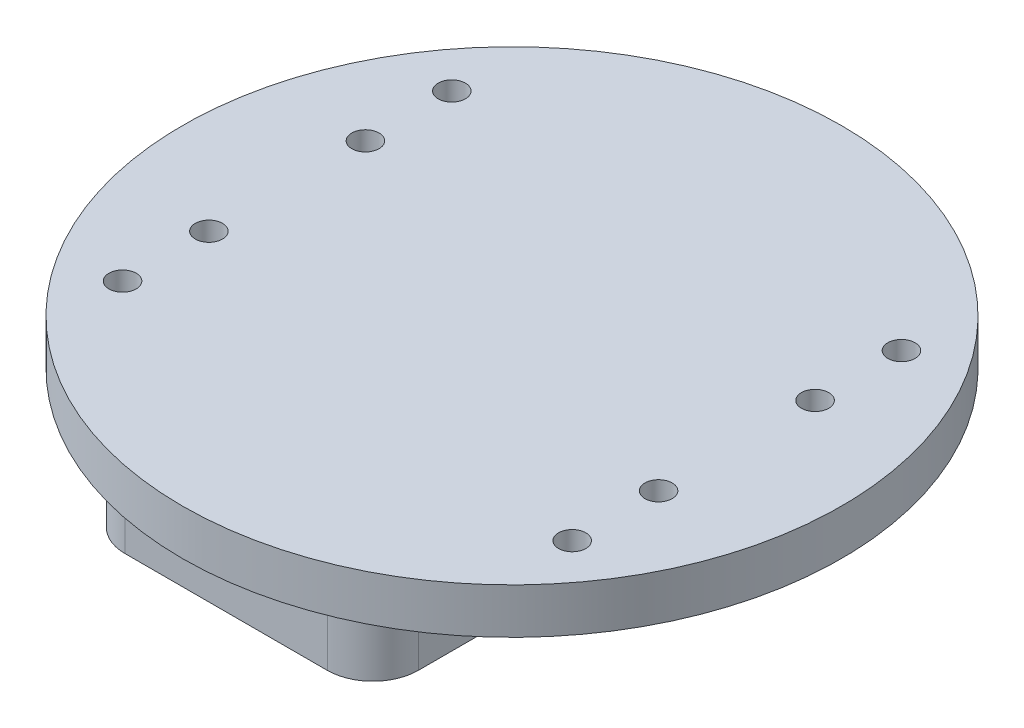
ISO-10303-21;
HEADER;
FILE_DESCRIPTION(('STEP AP214'),'2;1');
FILE_NAME('part.step','',(''),(''),'','','');
FILE_SCHEMA(('AUTOMOTIVE_DESIGN { 1 0 10303 214 1 1 1 1 }'));
ENDSEC;
DATA;
#1=APPLICATION_CONTEXT('core data for automotive mechanical design processes');
#2=APPLICATION_PROTOCOL_DEFINITION('international standard','automotive_design',2000,#1);
#3=PRODUCT_CONTEXT('',#1,'mechanical');
#4=PRODUCT('Part','Part','',(#3));
#5=PRODUCT_RELATED_PRODUCT_CATEGORY('part','',(#4));
#6=PRODUCT_DEFINITION_FORMATION('','',#4);
#7=PRODUCT_DEFINITION_CONTEXT('part definition',#1,'design');
#8=PRODUCT_DEFINITION('design','',#6,#7);
#9=PRODUCT_DEFINITION_SHAPE('','',#8);
#10=(LENGTH_UNIT() NAMED_UNIT(*) SI_UNIT(.MILLI.,.METRE.));
#11=(NAMED_UNIT(*) PLANE_ANGLE_UNIT() SI_UNIT($,.RADIAN.));
#12=(NAMED_UNIT(*) SI_UNIT($,.STERADIAN.) SOLID_ANGLE_UNIT());
#13=UNCERTAINTY_MEASURE_WITH_UNIT(LENGTH_MEASURE(1.E-05),#10,'distance_accuracy_value','');
#14=(GEOMETRIC_REPRESENTATION_CONTEXT(3) GLOBAL_UNCERTAINTY_ASSIGNED_CONTEXT((#13)) GLOBAL_UNIT_ASSIGNED_CONTEXT((#10,
#11,#12)) REPRESENTATION_CONTEXT('',''));
#15=CARTESIAN_POINT('',(0.,0.,0.));
#16=DIRECTION('',(0.,0.,1.));
#17=DIRECTION('',(1.,0.,0.));
#18=AXIS2_PLACEMENT_3D('',#15,#16,#17);
#19=CARTESIAN_POINT('',(0.,0.,0.));
#20=DIRECTION('',(0.,1.,0.));
#21=DIRECTION('',(0.,0.,1.));
#22=AXIS2_PLACEMENT_3D('',#19,#20,#21);
#23=PLANE('',#22);
#24=CARTESIAN_POINT('',(49.4583477426702,0.,17.2159503754645));
#25=DIRECTION('',(0.,1.,0.));
#26=DIRECTION('',(0.,0.,-1.));
#27=AXIS2_PLACEMENT_3D('',#24,#25,#26);
#28=CIRCLE('',#27,3.);
#29=CARTESIAN_POINT('',(49.4583477426702,0.,14.2159503754645));
#30=VERTEX_POINT('',#29);
#31=EDGE_CURVE('E336',#30,#30,#28,.T.);
#32=ORIENTED_EDGE('',*,*,#31,.T.);
#33=EDGE_LOOP('',(#32));
#34=FACE_BOUND('',#33,.T.);
#35=CARTESIAN_POINT('',(49.4583477426704,0.,36.2159503754645));
#36=DIRECTION('',(0.,1.,0.));
#37=DIRECTION('',(0.,0.,-1.));
#38=AXIS2_PLACEMENT_3D('',#35,#36,#37);
#39=CIRCLE('',#38,3.);
#40=CARTESIAN_POINT('',(49.4583477426704,0.,33.2159503754645));
#41=VERTEX_POINT('',#40);
#42=EDGE_CURVE('E332',#41,#41,#39,.T.);
#43=ORIENTED_EDGE('',*,*,#42,.T.);
#44=EDGE_LOOP('',(#43));
#45=FACE_BOUND('',#44,.T.);
#46=CARTESIAN_POINT('',(49.4583477426702,0.,-17.2159503754645));
#47=DIRECTION('',(0.,-1.,0.));
#48=DIRECTION('',(0.,0.,1.));
#49=AXIS2_PLACEMENT_3D('',#46,#47,#48);
#50=CIRCLE('',#49,3.);
#51=CARTESIAN_POINT('',(49.4583477426702,0.,-14.2159503754645));
#52=VERTEX_POINT('',#51);
#53=EDGE_CURVE('E328',#52,#52,#50,.T.);
#54=ORIENTED_EDGE('',*,*,#53,.F.);
#55=EDGE_LOOP('',(#54));
#56=FACE_BOUND('',#55,.T.);
#57=CARTESIAN_POINT('',(49.4583477426704,0.,-36.2159503754645));
#58=DIRECTION('',(0.,-1.,0.));
#59=DIRECTION('',(0.,0.,1.));
#60=AXIS2_PLACEMENT_3D('',#57,#58,#59);
#61=CIRCLE('',#60,3.);
#62=CARTESIAN_POINT('',(49.4583477426704,0.,-33.2159503754645));
#63=VERTEX_POINT('',#62);
#64=EDGE_CURVE('E324',#63,#63,#61,.T.);
#65=ORIENTED_EDGE('',*,*,#64,.F.);
#66=EDGE_LOOP('',(#65));
#67=FACE_BOUND('',#66,.T.);
#68=CARTESIAN_POINT('',(-49.4583477426702,0.,-17.2159503754645));
#69=DIRECTION('',(0.,1.,0.));
#70=DIRECTION('',(0.,0.,1.));
#71=AXIS2_PLACEMENT_3D('',#68,#69,#70);
#72=CIRCLE('',#71,3.);
#73=CARTESIAN_POINT('',(-49.4583477426702,0.,-14.2159503754645));
#74=VERTEX_POINT('',#73);
#75=EDGE_CURVE('E320',#74,#74,#72,.T.);
#76=ORIENTED_EDGE('',*,*,#75,.T.);
#77=EDGE_LOOP('',(#76));
#78=FACE_BOUND('',#77,.T.);
#79=CARTESIAN_POINT('',(-49.4583477426704,0.,-36.2159503754645));
#80=DIRECTION('',(0.,1.,0.));
#81=DIRECTION('',(0.,0.,1.));
#82=AXIS2_PLACEMENT_3D('',#79,#80,#81);
#83=CIRCLE('',#82,3.);
#84=CARTESIAN_POINT('',(-49.4583477426704,0.,-33.2159503754645));
#85=VERTEX_POINT('',#84);
#86=EDGE_CURVE('E316',#85,#85,#83,.T.);
#87=ORIENTED_EDGE('',*,*,#86,.T.);
#88=EDGE_LOOP('',(#87));
#89=FACE_BOUND('',#88,.T.);
#90=CARTESIAN_POINT('',(-49.4583477426702,0.,17.2159503754645));
#91=DIRECTION('',(0.,-1.,0.));
#92=DIRECTION('',(0.,0.,-1.));
#93=AXIS2_PLACEMENT_3D('',#90,#91,#92);
#94=CIRCLE('',#93,3.);
#95=CARTESIAN_POINT('',(-49.4583477426702,0.,14.2159503754645));
#96=VERTEX_POINT('',#95);
#97=EDGE_CURVE('E312',#96,#96,#94,.T.);
#98=ORIENTED_EDGE('',*,*,#97,.F.);
#99=EDGE_LOOP('',(#98));
#100=FACE_BOUND('',#99,.T.);
#101=CARTESIAN_POINT('',(-49.4583477426704,0.,36.2159503754645));
#102=DIRECTION('',(0.,-1.,0.));
#103=DIRECTION('',(0.,0.,-1.));
#104=AXIS2_PLACEMENT_3D('',#101,#102,#103);
#105=CIRCLE('',#104,3.);
#106=CARTESIAN_POINT('',(-49.4583477426704,0.,33.2159503754645));
#107=VERTEX_POINT('',#106);
#108=EDGE_CURVE('E308',#107,#107,#105,.T.);
#109=ORIENTED_EDGE('',*,*,#108,.F.);
#110=EDGE_LOOP('',(#109));
#111=FACE_BOUND('',#110,.T.);
#112=DIRECTION('',(1.,0.,0.));
#113=VECTOR('',#112,1.);
#114=CARTESIAN_POINT('',(-32.2469004511277,0.,-15.536222893696));
#115=LINE('',#114,#113);
#116=CARTESIAN_POINT('',(-32.2469004511277,0.,-15.536222893696));
#117=VERTEX_POINT('',#116);
#118=CARTESIAN_POINT('',(32.2469004511276,0.,-15.536222893696));
#119=VERTEX_POINT('',#118);
#120=EDGE_CURVE('E162',#117,#119,#115,.T.);
#121=ORIENTED_EDGE('',*,*,#120,.T.);
#122=DIRECTION('',(0.,0.,-1.));
#123=VECTOR('',#122,1.);
#124=CARTESIAN_POINT('',(32.2469004511277,0.,-52.8651138281339));
#125=LINE('',#124,#123);
#126=CARTESIAN_POINT('',(32.2469004511277,0.,-52.8651138281339));
#127=VERTEX_POINT('',#126);
#128=EDGE_CURVE('E128',#119,#127,#125,.T.);
#129=ORIENTED_EDGE('',*,*,#128,.T.);
#130=CARTESIAN_POINT('',(22.2469004511277,0.,-52.8651138281339));
#131=DIRECTION('',(0.,1.,0.));
#132=DIRECTION('',(0.,0.,1.));
#133=AXIS2_PLACEMENT_3D('',#130,#131,#132);
#134=CIRCLE('',#133,10.);
#135=CARTESIAN_POINT('',(22.2469004511277,0.,-62.8651138281339));
#136=VERTEX_POINT('',#135);
#137=EDGE_CURVE('E145',#127,#136,#134,.T.);
#138=ORIENTED_EDGE('',*,*,#137,.T.);
#139=DIRECTION('',(-1.,0.,0.));
#140=VECTOR('',#139,1.);
#141=CARTESIAN_POINT('',(-22.2469004511277,0.,-62.8651138281339));
#142=LINE('',#141,#140);
#143=CARTESIAN_POINT('',(-22.2469004511277,0.,-62.8651138281339));
#144=VERTEX_POINT('',#143);
#145=EDGE_CURVE('E48',#136,#144,#142,.T.);
#146=ORIENTED_EDGE('',*,*,#145,.T.);
#147=CARTESIAN_POINT('',(-22.2469004511277,0.,-52.8651138281339));
#148=DIRECTION('',(0.,1.,0.));
#149=DIRECTION('',(0.,0.,1.));
#150=AXIS2_PLACEMENT_3D('',#147,#148,#149);
#151=CIRCLE('',#150,10.);
#152=CARTESIAN_POINT('',(-32.2469004511277,0.,-52.8651138281339));
#153=VERTEX_POINT('',#152);
#154=EDGE_CURVE('E168',#144,#153,#151,.T.);
#155=ORIENTED_EDGE('',*,*,#154,.T.);
#156=DIRECTION('',(0.,0.,1.));
#157=VECTOR('',#156,1.);
#158=CARTESIAN_POINT('',(-32.2469004511277,0.,-52.8651138281339));
#159=LINE('',#158,#157);
#160=EDGE_CURVE('E165',#153,#117,#159,.T.);
#161=ORIENTED_EDGE('',*,*,#160,.T.);
#162=EDGE_LOOP('',(#121,#129,#138,#146,#155,#161));
#163=FACE_BOUND('',#162,.T.);
#164=CARTESIAN_POINT('',(0.,0.,0.));
#165=DIRECTION('',(0.,1.,0.));
#166=DIRECTION('',(0.,0.,1.));
#167=AXIS2_PLACEMENT_3D('',#164,#165,#166);
#168=CIRCLE('',#167,72.5);
#169=CARTESIAN_POINT('',(0.,0.,72.5));
#170=VERTEX_POINT('',#169);
#171=EDGE_CURVE('E37',#170,#170,#168,.T.);
#172=ORIENTED_EDGE('',*,*,#171,.F.);
#173=EDGE_LOOP('',(#172));
#174=FACE_BOUND('',#173,.T.);
#175=DIRECTION('',(0.,0.,1.));
#176=VECTOR('',#175,1.);
#177=CARTESIAN_POINT('',(32.2469004511277,0.,52.8651138281339));
#178=LINE('',#177,#176);
#179=CARTESIAN_POINT('',(32.2469004511276,0.,15.536222893696));
#180=VERTEX_POINT('',#179);
#181=CARTESIAN_POINT('',(32.2469004511277,0.,52.8651138281339));
#182=VERTEX_POINT('',#181);
#183=EDGE_CURVE('E133',#180,#182,#178,.T.);
#184=ORIENTED_EDGE('',*,*,#183,.F.);
#185=DIRECTION('',(1.,0.,0.));
#186=VECTOR('',#185,1.);
#187=CARTESIAN_POINT('',(-32.2469004511277,0.,15.536222893696));
#188=LINE('',#187,#186);
#189=CARTESIAN_POINT('',(-32.2469004511277,0.,15.536222893696));
#190=VERTEX_POINT('',#189);
#191=EDGE_CURVE('E186',#190,#180,#188,.T.);
#192=ORIENTED_EDGE('',*,*,#191,.F.);
#193=DIRECTION('',(0.,0.,-1.));
#194=VECTOR('',#193,1.);
#195=CARTESIAN_POINT('',(-32.2469004511277,0.,52.8651138281339));
#196=LINE('',#195,#194);
#197=CARTESIAN_POINT('',(-32.2469004511277,0.,52.8651138281339));
#198=VERTEX_POINT('',#197);
#199=EDGE_CURVE('E206',#198,#190,#196,.T.);
#200=ORIENTED_EDGE('',*,*,#199,.F.);
#201=CARTESIAN_POINT('',(-22.2469004511277,0.,52.8651138281339));
#202=DIRECTION('',(0.,-1.,0.));
#203=DIRECTION('',(0.,0.,-1.));
#204=AXIS2_PLACEMENT_3D('',#201,#202,#203);
#205=CIRCLE('',#204,10.);
#206=CARTESIAN_POINT('',(-22.2469004511277,0.,62.8651138281339));
#207=VERTEX_POINT('',#206);
#208=EDGE_CURVE('E203',#207,#198,#205,.T.);
#209=ORIENTED_EDGE('',*,*,#208,.F.);
#210=DIRECTION('',(-1.,0.,0.));
#211=VECTOR('',#210,1.);
#212=CARTESIAN_POINT('',(-22.2469004511277,0.,62.8651138281339));
#213=LINE('',#212,#211);
#214=CARTESIAN_POINT('',(22.2469004511277,0.,62.8651138281339));
#215=VERTEX_POINT('',#214);
#216=EDGE_CURVE('E200',#215,#207,#213,.T.);
#217=ORIENTED_EDGE('',*,*,#216,.F.);
#218=CARTESIAN_POINT('',(22.2469004511277,0.,52.8651138281339));
#219=DIRECTION('',(0.,-1.,0.));
#220=DIRECTION('',(0.,0.,-1.));
#221=AXIS2_PLACEMENT_3D('',#218,#219,#220);
#222=CIRCLE('',#221,10.);
#223=EDGE_CURVE('E56',#182,#215,#222,.T.);
#224=ORIENTED_EDGE('',*,*,#223,.F.);
#225=EDGE_LOOP('',(#184,#192,#200,#209,#217,#224));
#226=FACE_BOUND('',#225,.T.);
#227=ADVANCED_FACE('F33',(#34,#45,#56,#67,#78,#89,#100,#111,#163,#174,#226),#23,.F.);
#228=CARTESIAN_POINT('',(0.,10.,0.));
#229=DIRECTION('',(0.,-1.,0.));
#230=DIRECTION('',(0.,0.,-1.));
#231=AXIS2_PLACEMENT_3D('',#228,#229,#230);
#232=CYLINDRICAL_SURFACE('',#231,72.5);
#233=CARTESIAN_POINT('',(0.,10.,0.));
#234=DIRECTION('',(0.,1.,0.));
#235=DIRECTION('',(0.,0.,1.));
#236=AXIS2_PLACEMENT_3D('',#233,#234,#235);
#237=CIRCLE('',#236,72.5);
#238=CARTESIAN_POINT('',(0.,10.,72.5));
#239=VERTEX_POINT('',#238);
#240=EDGE_CURVE('E11',#239,#239,#237,.T.);
#241=ORIENTED_EDGE('',*,*,#240,.F.);
#242=EDGE_LOOP('',(#241));
#243=FACE_BOUND('',#242,.T.);
#244=ORIENTED_EDGE('',*,*,#171,.T.);
#245=EDGE_LOOP('',(#244));
#246=FACE_BOUND('',#245,.T.);
#247=ADVANCED_FACE('F35',(#243,#246),#232,.T.);
#248=CARTESIAN_POINT('',(0.,10.,0.));
#249=DIRECTION('',(0.,1.,0.));
#250=DIRECTION('',(0.,0.,1.));
#251=AXIS2_PLACEMENT_3D('',#248,#249,#250);
#252=PLANE('',#251);
#253=CARTESIAN_POINT('',(49.4583477426702,10.,17.2159503754645));
#254=DIRECTION('',(0.,1.,0.));
#255=DIRECTION('',(0.,0.,-1.));
#256=AXIS2_PLACEMENT_3D('',#253,#254,#255);
#257=CIRCLE('',#256,3.);
#258=CARTESIAN_POINT('',(49.4583477426702,10.,14.2159503754645));
#259=VERTEX_POINT('',#258);
#260=EDGE_CURVE('E278',#259,#259,#257,.T.);
#261=ORIENTED_EDGE('',*,*,#260,.F.);
#262=EDGE_LOOP('',(#261));
#263=FACE_BOUND('',#262,.T.);
#264=CARTESIAN_POINT('',(49.4583477426704,10.,36.2159503754645));
#265=DIRECTION('',(0.,1.,0.));
#266=DIRECTION('',(0.,0.,-1.));
#267=AXIS2_PLACEMENT_3D('',#264,#265,#266);
#268=CIRCLE('',#267,3.);
#269=CARTESIAN_POINT('',(49.4583477426704,10.,33.2159503754645));
#270=VERTEX_POINT('',#269);
#271=EDGE_CURVE('E282',#270,#270,#268,.T.);
#272=ORIENTED_EDGE('',*,*,#271,.F.);
#273=EDGE_LOOP('',(#272));
#274=FACE_BOUND('',#273,.T.);
#275=CARTESIAN_POINT('',(49.4583477426702,10.,-17.2159503754645));
#276=DIRECTION('',(0.,-1.,0.));
#277=DIRECTION('',(0.,0.,1.));
#278=AXIS2_PLACEMENT_3D('',#275,#276,#277);
#279=CIRCLE('',#278,3.);
#280=CARTESIAN_POINT('',(49.4583477426702,10.,-14.2159503754645));
#281=VERTEX_POINT('',#280);
#282=EDGE_CURVE('E286',#281,#281,#279,.T.);
#283=ORIENTED_EDGE('',*,*,#282,.T.);
#284=EDGE_LOOP('',(#283));
#285=FACE_BOUND('',#284,.T.);
#286=CARTESIAN_POINT('',(49.4583477426704,10.,-36.2159503754645));
#287=DIRECTION('',(0.,-1.,0.));
#288=DIRECTION('',(0.,0.,1.));
#289=AXIS2_PLACEMENT_3D('',#286,#287,#288);
#290=CIRCLE('',#289,3.);
#291=CARTESIAN_POINT('',(49.4583477426704,10.,-33.2159503754645));
#292=VERTEX_POINT('',#291);
#293=EDGE_CURVE('E290',#292,#292,#290,.T.);
#294=ORIENTED_EDGE('',*,*,#293,.T.);
#295=EDGE_LOOP('',(#294));
#296=FACE_BOUND('',#295,.T.);
#297=CARTESIAN_POINT('',(-49.4583477426702,10.,-17.2159503754645));
#298=DIRECTION('',(0.,1.,0.));
#299=DIRECTION('',(0.,0.,1.));
#300=AXIS2_PLACEMENT_3D('',#297,#298,#299);
#301=CIRCLE('',#300,3.);
#302=CARTESIAN_POINT('',(-49.4583477426702,10.,-14.2159503754645));
#303=VERTEX_POINT('',#302);
#304=EDGE_CURVE('E294',#303,#303,#301,.T.);
#305=ORIENTED_EDGE('',*,*,#304,.F.);
#306=EDGE_LOOP('',(#305));
#307=FACE_BOUND('',#306,.T.);
#308=CARTESIAN_POINT('',(-49.4583477426704,10.,-36.2159503754645));
#309=DIRECTION('',(0.,1.,0.));
#310=DIRECTION('',(0.,0.,1.));
#311=AXIS2_PLACEMENT_3D('',#308,#309,#310);
#312=CIRCLE('',#311,3.);
#313=CARTESIAN_POINT('',(-49.4583477426704,10.,-33.2159503754645));
#314=VERTEX_POINT('',#313);
#315=EDGE_CURVE('E298',#314,#314,#312,.T.);
#316=ORIENTED_EDGE('',*,*,#315,.F.);
#317=EDGE_LOOP('',(#316));
#318=FACE_BOUND('',#317,.T.);
#319=CARTESIAN_POINT('',(-49.4583477426702,10.,17.2159503754645));
#320=DIRECTION('',(0.,-1.,0.));
#321=DIRECTION('',(0.,0.,-1.));
#322=AXIS2_PLACEMENT_3D('',#319,#320,#321);
#323=CIRCLE('',#322,3.);
#324=CARTESIAN_POINT('',(-49.4583477426702,10.,14.2159503754645));
#325=VERTEX_POINT('',#324);
#326=EDGE_CURVE('E302',#325,#325,#323,.T.);
#327=ORIENTED_EDGE('',*,*,#326,.T.);
#328=EDGE_LOOP('',(#327));
#329=FACE_BOUND('',#328,.T.);
#330=CARTESIAN_POINT('',(-49.4583477426704,10.,36.2159503754645));
#331=DIRECTION('',(0.,-1.,0.));
#332=DIRECTION('',(0.,0.,-1.));
#333=AXIS2_PLACEMENT_3D('',#330,#331,#332);
#334=CIRCLE('',#333,3.);
#335=CARTESIAN_POINT('',(-49.4583477426704,10.,33.2159503754645));
#336=VERTEX_POINT('',#335);
#337=EDGE_CURVE('E163',#336,#336,#334,.T.);
#338=ORIENTED_EDGE('',*,*,#337,.T.);
#339=EDGE_LOOP('',(#338));
#340=FACE_BOUND('',#339,.T.);
#341=ORIENTED_EDGE('',*,*,#240,.T.);
#342=EDGE_LOOP('',(#341));
#343=FACE_BOUND('',#342,.T.);
#344=ADVANCED_FACE('F264',(#263,#274,#285,#296,#307,#318,#329,#340,#343),#252,.T.);
#345=CARTESIAN_POINT('',(32.2469004511277,-15.,52.8651138281339));
#346=DIRECTION('',(-1.,0.,0.));
#347=DIRECTION('',(0.,0.,1.));
#348=AXIS2_PLACEMENT_3D('',#345,#346,#347);
#349=PLANE('',#348);
#350=ORIENTED_EDGE('',*,*,#183,.T.);
#351=DIRECTION('',(0.,1.,0.));
#352=VECTOR('',#351,1.);
#353=CARTESIAN_POINT('',(32.2469004511277,-15.,52.8651138281339));
#354=LINE('',#353,#352);
#355=CARTESIAN_POINT('',(32.2469004511277,-15.,52.8651138281339));
#356=VERTEX_POINT('',#355);
#357=EDGE_CURVE('E225',#356,#182,#354,.T.);
#358=ORIENTED_EDGE('',*,*,#357,.F.);
#359=DIRECTION('',(0.,0.,1.));
#360=VECTOR('',#359,1.);
#361=CARTESIAN_POINT('',(32.2469004511277,-15.,52.8651138281339));
#362=LINE('',#361,#360);
#363=CARTESIAN_POINT('',(32.2469004511276,-15.,15.536222893696));
#364=VERTEX_POINT('',#363);
#365=EDGE_CURVE('E182',#364,#356,#362,.T.);
#366=ORIENTED_EDGE('',*,*,#365,.F.);
#367=DIRECTION('',(0.,1.,0.));
#368=VECTOR('',#367,1.);
#369=CARTESIAN_POINT('',(32.2469004511276,-15.,15.536222893696));
#370=LINE('',#369,#368);
#371=EDGE_CURVE('E196',#364,#180,#370,.T.);
#372=ORIENTED_EDGE('',*,*,#371,.T.);
#373=EDGE_LOOP('',(#350,#358,#366,#372));
#374=FACE_BOUND('',#373,.T.);
#375=ADVANCED_FACE('F241',(#374),#349,.F.);
#376=CARTESIAN_POINT('',(22.2469004511277,-15.,52.8651138281339));
#377=DIRECTION('',(0.,1.,0.));
#378=DIRECTION('',(0.,0.,1.));
#379=AXIS2_PLACEMENT_3D('',#376,#377,#378);
#380=CYLINDRICAL_SURFACE('',#379,10.);
#381=ORIENTED_EDGE('',*,*,#223,.T.);
#382=DIRECTION('',(0.,1.,0.));
#383=VECTOR('',#382,1.);
#384=CARTESIAN_POINT('',(22.2469004511277,-15.,62.8651138281339));
#385=LINE('',#384,#383);
#386=CARTESIAN_POINT('',(22.2469004511277,-15.,62.8651138281339));
#387=VERTEX_POINT('',#386);
#388=EDGE_CURVE('E222',#387,#215,#385,.T.);
#389=ORIENTED_EDGE('',*,*,#388,.F.);
#390=CARTESIAN_POINT('',(22.2469004511277,-15.,52.8651138281339));
#391=DIRECTION('',(0.,-1.,0.));
#392=DIRECTION('',(0.,0.,-1.));
#393=AXIS2_PLACEMENT_3D('',#390,#391,#392);
#394=CIRCLE('',#393,10.);
#395=EDGE_CURVE('E185',#356,#387,#394,.T.);
#396=ORIENTED_EDGE('',*,*,#395,.F.);
#397=ORIENTED_EDGE('',*,*,#357,.T.);
#398=EDGE_LOOP('',(#381,#389,#396,#397));
#399=FACE_BOUND('',#398,.T.);
#400=ADVANCED_FACE('F256',(#399),#380,.T.);
#401=CARTESIAN_POINT('',(-22.2469004511277,-15.,62.8651138281339));
#402=DIRECTION('',(0.,0.,-1.));
#403=DIRECTION('',(-1.,0.,0.));
#404=AXIS2_PLACEMENT_3D('',#401,#402,#403);
#405=PLANE('',#404);
#406=ORIENTED_EDGE('',*,*,#216,.T.);
#407=DIRECTION('',(0.,1.,0.));
#408=VECTOR('',#407,1.);
#409=CARTESIAN_POINT('',(-22.2469004511277,-15.,62.8651138281339));
#410=LINE('',#409,#408);
#411=CARTESIAN_POINT('',(-22.2469004511277,-15.,62.8651138281339));
#412=VERTEX_POINT('',#411);
#413=EDGE_CURVE('E219',#412,#207,#410,.T.);
#414=ORIENTED_EDGE('',*,*,#413,.F.);
#415=DIRECTION('',(-1.,0.,0.));
#416=VECTOR('',#415,1.);
#417=CARTESIAN_POINT('',(-22.2469004511277,-15.,62.8651138281339));
#418=LINE('',#417,#416);
#419=EDGE_CURVE('E188',#387,#412,#418,.T.);
#420=ORIENTED_EDGE('',*,*,#419,.F.);
#421=ORIENTED_EDGE('',*,*,#388,.T.);
#422=EDGE_LOOP('',(#406,#414,#420,#421));
#423=FACE_BOUND('',#422,.T.);
#424=ADVANCED_FACE('F255',(#423),#405,.F.);
#425=CARTESIAN_POINT('',(-22.2469004511277,-15.,52.8651138281339));
#426=DIRECTION('',(0.,1.,0.));
#427=DIRECTION('',(0.,0.,1.));
#428=AXIS2_PLACEMENT_3D('',#425,#426,#427);
#429=CYLINDRICAL_SURFACE('',#428,10.);
#430=ORIENTED_EDGE('',*,*,#208,.T.);
#431=DIRECTION('',(0.,1.,0.));
#432=VECTOR('',#431,1.);
#433=CARTESIAN_POINT('',(-32.2469004511277,-15.,52.8651138281339));
#434=LINE('',#433,#432);
#435=CARTESIAN_POINT('',(-32.2469004511277,-15.,52.8651138281339));
#436=VERTEX_POINT('',#435);
#437=EDGE_CURVE('E216',#436,#198,#434,.T.);
#438=ORIENTED_EDGE('',*,*,#437,.F.);
#439=CARTESIAN_POINT('',(-22.2469004511277,-15.,52.8651138281339));
#440=DIRECTION('',(0.,-1.,0.));
#441=DIRECTION('',(0.,0.,-1.));
#442=AXIS2_PLACEMENT_3D('',#439,#440,#441);
#443=CIRCLE('',#442,10.);
#444=EDGE_CURVE('E190',#412,#436,#443,.T.);
#445=ORIENTED_EDGE('',*,*,#444,.F.);
#446=ORIENTED_EDGE('',*,*,#413,.T.);
#447=EDGE_LOOP('',(#430,#438,#445,#446));
#448=FACE_BOUND('',#447,.T.);
#449=ADVANCED_FACE('F251',(#448),#429,.T.);
#450=CARTESIAN_POINT('',(-32.2469004511277,-15.,52.8651138281339));
#451=DIRECTION('',(1.,0.,0.));
#452=DIRECTION('',(0.,0.,-1.));
#453=AXIS2_PLACEMENT_3D('',#450,#451,#452);
#454=PLANE('',#453);
#455=ORIENTED_EDGE('',*,*,#199,.T.);
#456=DIRECTION('',(0.,1.,0.));
#457=VECTOR('',#456,1.);
#458=CARTESIAN_POINT('',(-32.2469004511277,-15.,15.536222893696));
#459=LINE('',#458,#457);
#460=CARTESIAN_POINT('',(-32.2469004511277,-15.,15.536222893696));
#461=VERTEX_POINT('',#460);
#462=EDGE_CURVE('E213',#461,#190,#459,.T.);
#463=ORIENTED_EDGE('',*,*,#462,.F.);
#464=DIRECTION('',(0.,0.,-1.));
#465=VECTOR('',#464,1.);
#466=CARTESIAN_POINT('',(-32.2469004511277,-15.,52.8651138281339));
#467=LINE('',#466,#465);
#468=EDGE_CURVE('E192',#436,#461,#467,.T.);
#469=ORIENTED_EDGE('',*,*,#468,.F.);
#470=ORIENTED_EDGE('',*,*,#437,.T.);
#471=EDGE_LOOP('',(#455,#463,#469,#470));
#472=FACE_BOUND('',#471,.T.);
#473=ADVANCED_FACE('F249',(#472),#454,.F.);
#474=CARTESIAN_POINT('',(-32.2469004511277,-15.,15.536222893696));
#475=DIRECTION('',(0.,0.,1.));
#476=DIRECTION('',(1.,0.,0.));
#477=AXIS2_PLACEMENT_3D('',#474,#475,#476);
#478=PLANE('',#477);
#479=ORIENTED_EDGE('',*,*,#191,.T.);
#480=ORIENTED_EDGE('',*,*,#371,.F.);
#481=DIRECTION('',(1.,0.,0.));
#482=VECTOR('',#481,1.);
#483=CARTESIAN_POINT('',(-32.2469004511277,-15.,15.536222893696));
#484=LINE('',#483,#482);
#485=EDGE_CURVE('E194',#461,#364,#484,.T.);
#486=ORIENTED_EDGE('',*,*,#485,.F.);
#487=ORIENTED_EDGE('',*,*,#462,.T.);
#488=EDGE_LOOP('',(#479,#480,#486,#487));
#489=FACE_BOUND('',#488,.T.);
#490=ADVANCED_FACE('F237',(#489),#478,.F.);
#491=CARTESIAN_POINT('',(-22.2469004511277,-15.,52.8651138281339));
#492=DIRECTION('',(0.,-1.,0.));
#493=DIRECTION('',(0.,0.,-1.));
#494=AXIS2_PLACEMENT_3D('',#491,#492,#493);
#495=PLANE('',#494);
#496=ORIENTED_EDGE('',*,*,#365,.T.);
#497=ORIENTED_EDGE('',*,*,#395,.T.);
#498=ORIENTED_EDGE('',*,*,#419,.T.);
#499=ORIENTED_EDGE('',*,*,#444,.T.);
#500=ORIENTED_EDGE('',*,*,#468,.T.);
#501=ORIENTED_EDGE('',*,*,#485,.T.);
#502=EDGE_LOOP('',(#496,#497,#498,#499,#500,#501));
#503=FACE_BOUND('',#502,.T.);
#504=ADVANCED_FACE('F243',(#503),#495,.T.);
#505=CARTESIAN_POINT('',(32.2469004511277,-15.,-52.8651138281339));
#506=DIRECTION('',(1.,0.,0.));
#507=DIRECTION('',(0.,0.,-1.));
#508=AXIS2_PLACEMENT_3D('',#505,#506,#507);
#509=PLANE('',#508);
#510=ORIENTED_EDGE('',*,*,#128,.F.);
#511=DIRECTION('',(0.,1.,0.));
#512=VECTOR('',#511,1.);
#513=CARTESIAN_POINT('',(32.2469004511276,-15.,-15.536222893696));
#514=LINE('',#513,#512);
#515=CARTESIAN_POINT('',(32.2469004511276,-15.,-15.536222893696));
#516=VERTEX_POINT('',#515);
#517=EDGE_CURVE('E122',#516,#119,#514,.T.);
#518=ORIENTED_EDGE('',*,*,#517,.F.);
#519=DIRECTION('',(0.,0.,-1.));
#520=VECTOR('',#519,1.);
#521=CARTESIAN_POINT('',(32.2469004511277,-15.,-52.8651138281339));
#522=LINE('',#521,#520);
#523=CARTESIAN_POINT('',(32.2469004511277,-15.,-52.8651138281339));
#524=VERTEX_POINT('',#523);
#525=EDGE_CURVE('E125',#516,#524,#522,.T.);
#526=ORIENTED_EDGE('',*,*,#525,.T.);
#527=DIRECTION('',(0.,1.,0.));
#528=VECTOR('',#527,1.);
#529=CARTESIAN_POINT('',(32.2469004511277,-15.,-52.8651138281339));
#530=LINE('',#529,#528);
#531=EDGE_CURVE('E160',#524,#127,#530,.T.);
#532=ORIENTED_EDGE('',*,*,#531,.T.);
#533=EDGE_LOOP('',(#510,#518,#526,#532));
#534=FACE_BOUND('',#533,.T.);
#535=ADVANCED_FACE('F124',(#534),#509,.T.);
#536=CARTESIAN_POINT('',(-32.2469004511277,-15.,-15.536222893696));
#537=DIRECTION('',(0.,0.,1.));
#538=DIRECTION('',(1.,0.,0.));
#539=AXIS2_PLACEMENT_3D('',#536,#537,#538);
#540=PLANE('',#539);
#541=ORIENTED_EDGE('',*,*,#120,.F.);
#542=DIRECTION('',(0.,1.,0.));
#543=VECTOR('',#542,1.);
#544=CARTESIAN_POINT('',(-32.2469004511277,-15.,-15.536222893696));
#545=LINE('',#544,#543);
#546=CARTESIAN_POINT('',(-32.2469004511277,-15.,-15.536222893696));
#547=VERTEX_POINT('',#546);
#548=EDGE_CURVE('E134',#547,#117,#545,.T.);
#549=ORIENTED_EDGE('',*,*,#548,.F.);
#550=DIRECTION('',(1.,0.,0.));
#551=VECTOR('',#550,1.);
#552=CARTESIAN_POINT('',(-32.2469004511277,-15.,-15.536222893696));
#553=LINE('',#552,#551);
#554=EDGE_CURVE('E140',#547,#516,#553,.T.);
#555=ORIENTED_EDGE('',*,*,#554,.T.);
#556=ORIENTED_EDGE('',*,*,#517,.T.);
#557=EDGE_LOOP('',(#541,#549,#555,#556));
#558=FACE_BOUND('',#557,.T.);
#559=ADVANCED_FACE('F147',(#558),#540,.T.);
#560=CARTESIAN_POINT('',(-32.2469004511277,-15.,-52.8651138281339));
#561=DIRECTION('',(-1.,0.,0.));
#562=DIRECTION('',(0.,0.,1.));
#563=AXIS2_PLACEMENT_3D('',#560,#561,#562);
#564=PLANE('',#563);
#565=ORIENTED_EDGE('',*,*,#160,.F.);
#566=DIRECTION('',(0.,1.,0.));
#567=VECTOR('',#566,1.);
#568=CARTESIAN_POINT('',(-32.2469004511277,-15.,-52.8651138281339));
#569=LINE('',#568,#567);
#570=CARTESIAN_POINT('',(-32.2469004511277,-15.,-52.8651138281339));
#571=VERTEX_POINT('',#570);
#572=EDGE_CURVE('E179',#571,#153,#569,.T.);
#573=ORIENTED_EDGE('',*,*,#572,.F.);
#574=DIRECTION('',(0.,0.,1.));
#575=VECTOR('',#574,1.);
#576=CARTESIAN_POINT('',(-32.2469004511277,-15.,-52.8651138281339));
#577=LINE('',#576,#575);
#578=EDGE_CURVE('E148',#571,#547,#577,.T.);
#579=ORIENTED_EDGE('',*,*,#578,.T.);
#580=ORIENTED_EDGE('',*,*,#548,.T.);
#581=EDGE_LOOP('',(#565,#573,#579,#580));
#582=FACE_BOUND('',#581,.T.);
#583=ADVANCED_FACE('F364',(#582),#564,.T.);
#584=CARTESIAN_POINT('',(-22.2469004511277,-15.,-52.8651138281339));
#585=DIRECTION('',(0.,1.,0.));
#586=DIRECTION('',(0.,0.,1.));
#587=AXIS2_PLACEMENT_3D('',#584,#585,#586);
#588=CYLINDRICAL_SURFACE('',#587,10.);
#589=ORIENTED_EDGE('',*,*,#154,.F.);
#590=DIRECTION('',(0.,1.,0.));
#591=VECTOR('',#590,1.);
#592=CARTESIAN_POINT('',(-22.2469004511277,-15.,-62.8651138281339));
#593=LINE('',#592,#591);
#594=CARTESIAN_POINT('',(-22.2469004511277,-15.,-62.8651138281339));
#595=VERTEX_POINT('',#594);
#596=EDGE_CURVE('E177',#595,#144,#593,.T.);
#597=ORIENTED_EDGE('',*,*,#596,.F.);
#598=CARTESIAN_POINT('',(-22.2469004511277,-15.,-52.8651138281339));
#599=DIRECTION('',(0.,1.,0.));
#600=DIRECTION('',(0.,0.,1.));
#601=AXIS2_PLACEMENT_3D('',#598,#599,#600);
#602=CIRCLE('',#601,10.);
#603=EDGE_CURVE('E150',#595,#571,#602,.T.);
#604=ORIENTED_EDGE('',*,*,#603,.T.);
#605=ORIENTED_EDGE('',*,*,#572,.T.);
#606=EDGE_LOOP('',(#589,#597,#604,#605));
#607=FACE_BOUND('',#606,.T.);
#608=ADVANCED_FACE('F367',(#607),#588,.T.);
#609=CARTESIAN_POINT('',(-22.2469004511277,-15.,-62.8651138281339));
#610=DIRECTION('',(0.,0.,-1.));
#611=DIRECTION('',(-1.,0.,0.));
#612=AXIS2_PLACEMENT_3D('',#609,#610,#611);
#613=PLANE('',#612);
#614=ORIENTED_EDGE('',*,*,#145,.F.);
#615=DIRECTION('',(0.,1.,0.));
#616=VECTOR('',#615,1.);
#617=CARTESIAN_POINT('',(22.2469004511277,-15.,-62.8651138281339));
#618=LINE('',#617,#616);
#619=CARTESIAN_POINT('',(22.2469004511277,-15.,-62.8651138281339));
#620=VERTEX_POINT('',#619);
#621=EDGE_CURVE('E175',#620,#136,#618,.T.);
#622=ORIENTED_EDGE('',*,*,#621,.F.);
#623=DIRECTION('',(-1.,0.,0.));
#624=VECTOR('',#623,1.);
#625=CARTESIAN_POINT('',(-22.2469004511277,-15.,-62.8651138281339));
#626=LINE('',#625,#624);
#627=EDGE_CURVE('E156',#620,#595,#626,.T.);
#628=ORIENTED_EDGE('',*,*,#627,.T.);
#629=ORIENTED_EDGE('',*,*,#596,.T.);
#630=EDGE_LOOP('',(#614,#622,#628,#629));
#631=FACE_BOUND('',#630,.T.);
#632=ADVANCED_FACE('F368',(#631),#613,.T.);
#633=CARTESIAN_POINT('',(22.2469004511277,-15.,-52.8651138281339));
#634=DIRECTION('',(0.,1.,0.));
#635=DIRECTION('',(0.,0.,1.));
#636=AXIS2_PLACEMENT_3D('',#633,#634,#635);
#637=CYLINDRICAL_SURFACE('',#636,10.);
#638=ORIENTED_EDGE('',*,*,#137,.F.);
#639=ORIENTED_EDGE('',*,*,#531,.F.);
#640=CARTESIAN_POINT('',(22.2469004511277,-15.,-52.8651138281339));
#641=DIRECTION('',(0.,1.,0.));
#642=DIRECTION('',(0.,0.,1.));
#643=AXIS2_PLACEMENT_3D('',#640,#641,#642);
#644=CIRCLE('',#643,10.);
#645=EDGE_CURVE('E144',#524,#620,#644,.T.);
#646=ORIENTED_EDGE('',*,*,#645,.T.);
#647=ORIENTED_EDGE('',*,*,#621,.T.);
#648=EDGE_LOOP('',(#638,#639,#646,#647));
#649=FACE_BOUND('',#648,.T.);
#650=ADVANCED_FACE('F371',(#649),#637,.T.);
#651=CARTESIAN_POINT('',(-22.2469004511277,-15.,-52.8651138281339));
#652=DIRECTION('',(0.,-1.,0.));
#653=DIRECTION('',(0.,0.,1.));
#654=AXIS2_PLACEMENT_3D('',#651,#652,#653);
#655=PLANE('',#654);
#656=ORIENTED_EDGE('',*,*,#525,.F.);
#657=ORIENTED_EDGE('',*,*,#554,.F.);
#658=ORIENTED_EDGE('',*,*,#578,.F.);
#659=ORIENTED_EDGE('',*,*,#603,.F.);
#660=ORIENTED_EDGE('',*,*,#627,.F.);
#661=ORIENTED_EDGE('',*,*,#645,.F.);
#662=EDGE_LOOP('',(#656,#657,#658,#659,#660,#661));
#663=FACE_BOUND('',#662,.T.);
#664=ADVANCED_FACE('F138',(#663),#655,.T.);
#665=CARTESIAN_POINT('',(-49.4583477426704,10.,36.2159503754645));
#666=DIRECTION('',(0.,-1.,0.));
#667=DIRECTION('',(0.,0.,-1.));
#668=AXIS2_PLACEMENT_3D('',#665,#666,#667);
#669=CYLINDRICAL_SURFACE('',#668,3.);
#670=ORIENTED_EDGE('',*,*,#337,.F.);
#671=EDGE_LOOP('',(#670));
#672=FACE_BOUND('',#671,.T.);
#673=ORIENTED_EDGE('',*,*,#108,.T.);
#674=EDGE_LOOP('',(#673));
#675=FACE_BOUND('',#674,.T.);
#676=ADVANCED_FACE('F378',(#672,#675),#669,.F.);
#677=CARTESIAN_POINT('',(-49.4583477426702,10.,17.2159503754645));
#678=DIRECTION('',(0.,-1.,0.));
#679=DIRECTION('',(0.,0.,-1.));
#680=AXIS2_PLACEMENT_3D('',#677,#678,#679);
#681=CYLINDRICAL_SURFACE('',#680,3.);
#682=ORIENTED_EDGE('',*,*,#326,.F.);
#683=EDGE_LOOP('',(#682));
#684=FACE_BOUND('',#683,.T.);
#685=ORIENTED_EDGE('',*,*,#97,.T.);
#686=EDGE_LOOP('',(#685));
#687=FACE_BOUND('',#686,.T.);
#688=ADVANCED_FACE('F452',(#684,#687),#681,.F.);
#689=CARTESIAN_POINT('',(-49.4583477426704,10.,-36.2159503754645));
#690=DIRECTION('',(0.,-1.,0.));
#691=DIRECTION('',(0.,0.,-1.));
#692=AXIS2_PLACEMENT_3D('',#689,#690,#691);
#693=CYLINDRICAL_SURFACE('',#692,3.);
#694=ORIENTED_EDGE('',*,*,#315,.T.);
#695=EDGE_LOOP('',(#694));
#696=FACE_BOUND('',#695,.T.);
#697=ORIENTED_EDGE('',*,*,#86,.F.);
#698=EDGE_LOOP('',(#697));
#699=FACE_BOUND('',#698,.T.);
#700=ADVANCED_FACE('F460',(#696,#699),#693,.F.);
#701=CARTESIAN_POINT('',(-49.4583477426702,10.,-17.2159503754645));
#702=DIRECTION('',(0.,-1.,0.));
#703=DIRECTION('',(0.,0.,-1.));
#704=AXIS2_PLACEMENT_3D('',#701,#702,#703);
#705=CYLINDRICAL_SURFACE('',#704,3.);
#706=ORIENTED_EDGE('',*,*,#304,.T.);
#707=EDGE_LOOP('',(#706));
#708=FACE_BOUND('',#707,.T.);
#709=ORIENTED_EDGE('',*,*,#75,.F.);
#710=EDGE_LOOP('',(#709));
#711=FACE_BOUND('',#710,.T.);
#712=ADVANCED_FACE('F470',(#708,#711),#705,.F.);
#713=CARTESIAN_POINT('',(49.4583477426704,10.,-36.2159503754645));
#714=DIRECTION('',(0.,-1.,0.));
#715=DIRECTION('',(0.,0.,-1.));
#716=AXIS2_PLACEMENT_3D('',#713,#714,#715);
#717=CYLINDRICAL_SURFACE('',#716,3.);
#718=ORIENTED_EDGE('',*,*,#293,.F.);
#719=EDGE_LOOP('',(#718));
#720=FACE_BOUND('',#719,.T.);
#721=ORIENTED_EDGE('',*,*,#64,.T.);
#722=EDGE_LOOP('',(#721));
#723=FACE_BOUND('',#722,.T.);
#724=ADVANCED_FACE('F479',(#720,#723),#717,.F.);
#725=CARTESIAN_POINT('',(49.4583477426702,10.,-17.2159503754645));
#726=DIRECTION('',(0.,-1.,0.));
#727=DIRECTION('',(0.,0.,-1.));
#728=AXIS2_PLACEMENT_3D('',#725,#726,#727);
#729=CYLINDRICAL_SURFACE('',#728,3.);
#730=ORIENTED_EDGE('',*,*,#282,.F.);
#731=EDGE_LOOP('',(#730));
#732=FACE_BOUND('',#731,.T.);
#733=ORIENTED_EDGE('',*,*,#53,.T.);
#734=EDGE_LOOP('',(#733));
#735=FACE_BOUND('',#734,.T.);
#736=ADVANCED_FACE('F535',(#732,#735),#729,.F.);
#737=CARTESIAN_POINT('',(49.4583477426704,10.,36.2159503754645));
#738=DIRECTION('',(0.,-1.,0.));
#739=DIRECTION('',(0.,0.,-1.));
#740=AXIS2_PLACEMENT_3D('',#737,#738,#739);
#741=CYLINDRICAL_SURFACE('',#740,3.);
#742=ORIENTED_EDGE('',*,*,#271,.T.);
#743=EDGE_LOOP('',(#742));
#744=FACE_BOUND('',#743,.T.);
#745=ORIENTED_EDGE('',*,*,#42,.F.);
#746=EDGE_LOOP('',(#745));
#747=FACE_BOUND('',#746,.T.);
#748=ADVANCED_FACE('F343',(#744,#747),#741,.F.);
#749=CARTESIAN_POINT('',(49.4583477426702,10.,17.2159503754645));
#750=DIRECTION('',(0.,-1.,0.));
#751=DIRECTION('',(0.,0.,-1.));
#752=AXIS2_PLACEMENT_3D('',#749,#750,#751);
#753=CYLINDRICAL_SURFACE('',#752,3.);
#754=ORIENTED_EDGE('',*,*,#260,.T.);
#755=EDGE_LOOP('',(#754));
#756=FACE_BOUND('',#755,.T.);
#757=ORIENTED_EDGE('',*,*,#31,.F.);
#758=EDGE_LOOP('',(#757));
#759=FACE_BOUND('',#758,.T.);
#760=ADVANCED_FACE('F340',(#756,#759),#753,.F.);
#761=CLOSED_SHELL('',(#227,#247,#344,#375,#400,#424,#449,#473,#490,#504,#535,#559,#583,#608,
#632,#650,#664,#676,#688,#700,#712,#724,#736,#748,#760));
#762=MANIFOLD_SOLID_BREP('B2',#761);
#763=ADVANCED_BREP_SHAPE_REPRESENTATION('',(#18,#762),#14);
#764=SHAPE_DEFINITION_REPRESENTATION(#9,#763);
ENDSEC;
END-ISO-10303-21;
